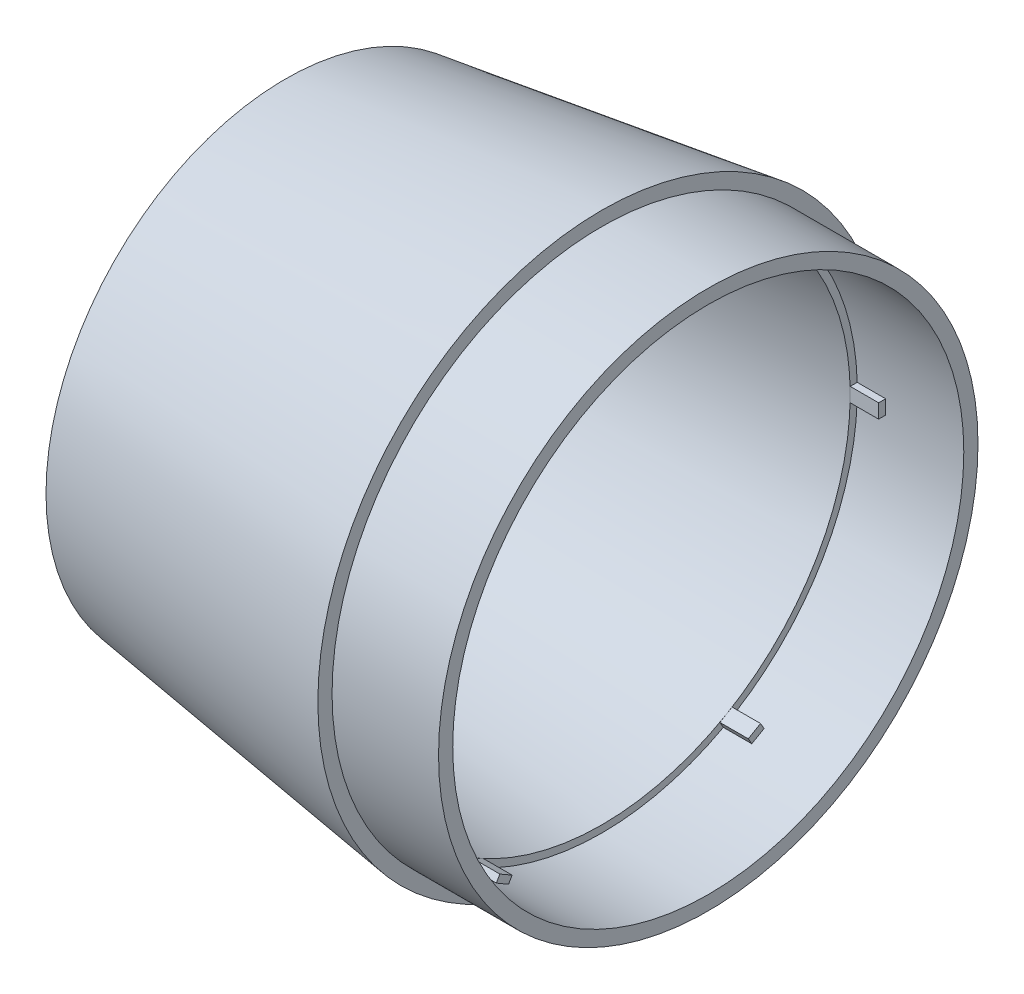
ISO-10303-21;
HEADER;
FILE_DESCRIPTION(('STEP AP214'),'2;1');
FILE_NAME('part.step','',(''),(''),'','','');
FILE_SCHEMA(('AUTOMOTIVE_DESIGN { 1 0 10303 214 1 1 1 1 }'));
ENDSEC;
DATA;
#1=APPLICATION_CONTEXT('core data for automotive mechanical design processes');
#2=APPLICATION_PROTOCOL_DEFINITION('international standard','automotive_design',2000,#1);
#3=PRODUCT_CONTEXT('',#1,'mechanical');
#4=PRODUCT('Part','Part','',(#3));
#5=PRODUCT_RELATED_PRODUCT_CATEGORY('part','',(#4));
#6=PRODUCT_DEFINITION_FORMATION('','',#4);
#7=PRODUCT_DEFINITION_CONTEXT('part definition',#1,'design');
#8=PRODUCT_DEFINITION('design','',#6,#7);
#9=PRODUCT_DEFINITION_SHAPE('','',#8);
#10=(LENGTH_UNIT() NAMED_UNIT(*) SI_UNIT(.MILLI.,.METRE.));
#11=(NAMED_UNIT(*) PLANE_ANGLE_UNIT() SI_UNIT($,.RADIAN.));
#12=(NAMED_UNIT(*) SI_UNIT($,.STERADIAN.) SOLID_ANGLE_UNIT());
#13=UNCERTAINTY_MEASURE_WITH_UNIT(LENGTH_MEASURE(1.E-05),#10,'distance_accuracy_value','');
#14=(GEOMETRIC_REPRESENTATION_CONTEXT(3) GLOBAL_UNCERTAINTY_ASSIGNED_CONTEXT((#13)) GLOBAL_UNIT_ASSIGNED_CONTEXT((#10,
#11,#12)) REPRESENTATION_CONTEXT('',''));
#15=CARTESIAN_POINT('',(0.,0.,0.));
#16=DIRECTION('',(0.,0.,1.));
#17=DIRECTION('',(1.,0.,0.));
#18=AXIS2_PLACEMENT_3D('',#15,#16,#17);
#19=CARTESIAN_POINT('',(0.,0.,0.));
#20=DIRECTION('',(1.,0.,0.));
#21=DIRECTION('',(0.,0.,-1.));
#22=AXIS2_PLACEMENT_3D('',#19,#20,#21);
#23=PLANE('',#22);
#24=DIRECTION('',(0.,0.50000000000001,0.866025403784433));
#25=VECTOR('',#24,1.);
#26=CARTESIAN_POINT('',(0.,-30.8108891324552,16.6339745962159));
#27=LINE('',#26,#25);
#28=CARTESIAN_POINT('',(0.,-30.8108891324552,16.6339745962159));
#29=VERTEX_POINT('',#28);
#30=CARTESIAN_POINT('',(0.,-30.3108891324552,17.5000000000003));
#31=VERTEX_POINT('',#30);
#32=EDGE_CURVE('E317',#29,#31,#27,.T.);
#33=ORIENTED_EDGE('',*,*,#32,.F.);
#34=DIRECTION('',(0.,-0.866025403784433,0.50000000000001));
#35=VECTOR('',#34,1.);
#36=CARTESIAN_POINT('',(0.,-30.8108891324552,16.6339745962159));
#37=LINE('',#36,#35);
#38=CARTESIAN_POINT('',(0.,-31.6648840844946,17.1270288116625));
#39=VERTEX_POINT('',#38);
#40=EDGE_CURVE('E309',#29,#39,#37,.T.);
#41=ORIENTED_EDGE('',*,*,#40,.T.);
#42=CARTESIAN_POINT('',(0.,0.,0.));
#43=DIRECTION('',(-1.,0.,0.));
#44=DIRECTION('',(0.,0.,1.));
#45=AXIS2_PLACEMENT_3D('',#42,#43,#44);
#46=CIRCLE('',#45,36.);
#47=CARTESIAN_POINT('',(0.,-31.664884084495,-17.1270288116618));
#48=VERTEX_POINT('',#47);
#49=EDGE_CURVE('E544',#48,#39,#46,.T.);
#50=ORIENTED_EDGE('',*,*,#49,.F.);
#51=DIRECTION('',(0.,-0.866025403784443,-0.499999999999992));
#52=VECTOR('',#51,1.);
#53=CARTESIAN_POINT('',(0.,-30.8108891324555,-16.6339745962153));
#54=LINE('',#53,#52);
#55=CARTESIAN_POINT('',(0.,-30.8108891324555,-16.6339745962153));
#56=VERTEX_POINT('',#55);
#57=EDGE_CURVE('E64',#56,#48,#54,.T.);
#58=ORIENTED_EDGE('',*,*,#57,.F.);
#59=DIRECTION('',(0.,-0.499999999999992,0.866025403784443));
#60=VECTOR('',#59,1.);
#61=CARTESIAN_POINT('',(0.,-29.8108891324555,-18.3660254037842));
#62=LINE('',#61,#60);
#63=CARTESIAN_POINT('',(0.,-30.3108891324555,-17.4999999999997));
#64=VERTEX_POINT('',#63);
#65=EDGE_CURVE('E296',#64,#56,#62,.T.);
#66=ORIENTED_EDGE('',*,*,#65,.F.);
#67=CARTESIAN_POINT('',(0.,0.,0.));
#68=DIRECTION('',(-1.,0.,0.));
#69=DIRECTION('',(0.,0.,1.));
#70=AXIS2_PLACEMENT_3D('',#67,#68,#69);
#71=CIRCLE('',#70,35.);
#72=EDGE_CURVE('E456',#64,#31,#71,.T.);
#73=ORIENTED_EDGE('',*,*,#72,.T.);
#74=EDGE_LOOP('',(#33,#41,#50,#58,#66,#73));
#75=FACE_BOUND('',#74,.T.);
#76=ADVANCED_FACE('F41',(#75),#23,.T.);
#77=CARTESIAN_POINT('',(0.,-29.8108891324555,-18.3660254037842));
#78=VERTEX_POINT('',#77);
#79=EDGE_CURVE('E299',#78,#64,#62,.T.);
#80=ORIENTED_EDGE('',*,*,#79,.F.);
#81=DIRECTION('',(0.,-0.866025403784443,-0.499999999999992));
#82=VECTOR('',#81,1.);
#83=CARTESIAN_POINT('',(0.,-29.8108891324555,-18.3660254037842));
#84=LINE('',#83,#82);
#85=CARTESIAN_POINT('',(0.,-30.664884084495,-18.8590796192307));
#86=VERTEX_POINT('',#85);
#87=EDGE_CURVE('E291',#78,#86,#84,.T.);
#88=ORIENTED_EDGE('',*,*,#87,.T.);
#89=CARTESIAN_POINT('',(0.,-1.,-35.9861084308932));
#90=VERTEX_POINT('',#89);
#91=EDGE_CURVE('E495',#90,#86,#46,.T.);
#92=ORIENTED_EDGE('',*,*,#91,.F.);
#93=DIRECTION('',(0.,0.,-1.));
#94=VECTOR('',#93,1.);
#95=CARTESIAN_POINT('',(0.,-1.,-35.));
#96=LINE('',#95,#94);
#97=CARTESIAN_POINT('',(0.,-1.,-35.));
#98=VERTEX_POINT('',#97);
#99=EDGE_CURVE('E265',#98,#90,#96,.T.);
#100=ORIENTED_EDGE('',*,*,#99,.F.);
#101=DIRECTION('',(0.,-1.,0.));
#102=VECTOR('',#101,1.);
#103=CARTESIAN_POINT('',(0.,1.,-35.));
#104=LINE('',#103,#102);
#105=CARTESIAN_POINT('',(0.,0.,-35.));
#106=VERTEX_POINT('',#105);
#107=EDGE_CURVE('E277',#106,#98,#104,.T.);
#108=ORIENTED_EDGE('',*,*,#107,.F.);
#109=EDGE_CURVE('E461',#106,#64,#71,.T.);
#110=ORIENTED_EDGE('',*,*,#109,.T.);
#111=EDGE_LOOP('',(#80,#88,#92,#100,#108,#110));
#112=FACE_BOUND('',#111,.T.);
#113=ADVANCED_FACE('F492',(#112),#23,.T.);
#114=CARTESIAN_POINT('',(0.,1.,-35.));
#115=VERTEX_POINT('',#114);
#116=EDGE_CURVE('E280',#115,#106,#104,.T.);
#117=ORIENTED_EDGE('',*,*,#116,.F.);
#118=DIRECTION('',(0.,0.,-1.));
#119=VECTOR('',#118,1.);
#120=CARTESIAN_POINT('',(0.,1.,-35.));
#121=LINE('',#120,#119);
#122=CARTESIAN_POINT('',(0.,1.,-35.9861084308932));
#123=VERTEX_POINT('',#122);
#124=EDGE_CURVE('E273',#115,#123,#121,.T.);
#125=ORIENTED_EDGE('',*,*,#124,.T.);
#126=CARTESIAN_POINT('',(0.,30.6648840844948,-18.8590796192312));
#127=VERTEX_POINT('',#126);
#128=EDGE_CURVE('E249',#127,#123,#46,.T.);
#129=ORIENTED_EDGE('',*,*,#128,.F.);
#130=DIRECTION('',(0.,0.866025403784436,-0.500000000000004));
#131=VECTOR('',#130,1.);
#132=CARTESIAN_POINT('',(0.,29.8108891324553,-18.3660254037846));
#133=LINE('',#132,#131);
#134=CARTESIAN_POINT('',(0.,29.8108891324553,-18.3660254037846));
#135=VERTEX_POINT('',#134);
#136=EDGE_CURVE('E237',#135,#127,#133,.T.);
#137=ORIENTED_EDGE('',*,*,#136,.F.);
#138=DIRECTION('',(0.,-0.500000000000004,-0.866025403784436));
#139=VECTOR('',#138,1.);
#140=CARTESIAN_POINT('',(0.,30.8108891324553,-16.6339745962157));
#141=LINE('',#140,#139);
#142=CARTESIAN_POINT('',(0.,30.3108891324553,-17.5000000000001));
#143=VERTEX_POINT('',#142);
#144=EDGE_CURVE('E221',#143,#135,#141,.T.);
#145=ORIENTED_EDGE('',*,*,#144,.F.);
#146=EDGE_CURVE('E462',#143,#106,#71,.T.);
#147=ORIENTED_EDGE('',*,*,#146,.T.);
#148=EDGE_LOOP('',(#117,#125,#129,#137,#145,#147));
#149=FACE_BOUND('',#148,.T.);
#150=ADVANCED_FACE('F246',(#149),#23,.T.);
#151=CARTESIAN_POINT('',(0.,30.8108891324553,-16.6339745962157));
#152=VERTEX_POINT('',#151);
#153=EDGE_CURVE('E228',#152,#143,#141,.T.);
#154=ORIENTED_EDGE('',*,*,#153,.F.);
#155=DIRECTION('',(0.,0.866025403784436,-0.500000000000004));
#156=VECTOR('',#155,1.);
#157=CARTESIAN_POINT('',(0.,30.8108891324553,-16.6339745962157));
#158=LINE('',#157,#156);
#159=CARTESIAN_POINT('',(0.,31.6648840844948,-17.1270288116623));
#160=VERTEX_POINT('',#159);
#161=EDGE_CURVE('E255',#152,#160,#158,.T.);
#162=ORIENTED_EDGE('',*,*,#161,.T.);
#163=CARTESIAN_POINT('',(0.,31.6648840844949,17.1270288116621));
#164=VERTEX_POINT('',#163);
#165=EDGE_CURVE('E392',#164,#160,#46,.T.);
#166=ORIENTED_EDGE('',*,*,#165,.F.);
#167=DIRECTION('',(0.,0.86602540378444,0.499999999999998));
#168=VECTOR('',#167,1.);
#169=CARTESIAN_POINT('',(0.,30.8108891324554,16.6339745962155));
#170=LINE('',#169,#168);
#171=CARTESIAN_POINT('',(0.,30.8108891324554,16.6339745962155));
#172=VERTEX_POINT('',#171);
#173=EDGE_CURVE('E321',#172,#164,#170,.T.);
#174=ORIENTED_EDGE('',*,*,#173,.F.);
#175=DIRECTION('',(0.,0.499999999999998,-0.86602540378444));
#176=VECTOR('',#175,1.);
#177=CARTESIAN_POINT('',(0.,29.8108891324554,18.3660254037844));
#178=LINE('',#177,#176);
#179=CARTESIAN_POINT('',(0.,30.3108891324554,17.4999999999999));
#180=VERTEX_POINT('',#179);
#181=EDGE_CURVE('E333',#180,#172,#178,.T.);
#182=ORIENTED_EDGE('',*,*,#181,.F.);
#183=EDGE_CURVE('E366',#180,#143,#71,.T.);
#184=ORIENTED_EDGE('',*,*,#183,.T.);
#185=EDGE_LOOP('',(#154,#162,#166,#174,#182,#184));
#186=FACE_BOUND('',#185,.T.);
#187=ADVANCED_FACE('F531',(#186),#23,.T.);
#188=CARTESIAN_POINT('',(0.,29.8108891324554,18.3660254037844));
#189=VERTEX_POINT('',#188);
#190=EDGE_CURVE('E338',#189,#180,#178,.T.);
#191=ORIENTED_EDGE('',*,*,#190,.F.);
#192=DIRECTION('',(0.,0.86602540378444,0.499999999999998));
#193=VECTOR('',#192,1.);
#194=CARTESIAN_POINT('',(0.,29.8108891324554,18.3660254037844));
#195=LINE('',#194,#193);
#196=CARTESIAN_POINT('',(0.,30.6648840844949,18.8590796192309));
#197=VERTEX_POINT('',#196);
#198=EDGE_CURVE('E328',#189,#197,#195,.T.);
#199=ORIENTED_EDGE('',*,*,#198,.T.);
#200=CARTESIAN_POINT('',(0.,1.,35.9861084308932));
#201=VERTEX_POINT('',#200);
#202=EDGE_CURVE('E388',#201,#197,#46,.T.);
#203=ORIENTED_EDGE('',*,*,#202,.F.);
#204=DIRECTION('',(0.,0.,1.));
#205=VECTOR('',#204,1.);
#206=CARTESIAN_POINT('',(0.,1.,35.));
#207=LINE('',#206,#205);
#208=CARTESIAN_POINT('',(0.,1.,35.));
#209=VERTEX_POINT('',#208);
#210=EDGE_CURVE('E342',#209,#201,#207,.T.);
#211=ORIENTED_EDGE('',*,*,#210,.F.);
#212=DIRECTION('',(0.,1.,0.));
#213=VECTOR('',#212,1.);
#214=CARTESIAN_POINT('',(0.,-1.,35.));
#215=LINE('',#214,#213);
#216=CARTESIAN_POINT('',(0.,0.,35.));
#217=VERTEX_POINT('',#216);
#218=EDGE_CURVE('E354',#217,#209,#215,.T.);
#219=ORIENTED_EDGE('',*,*,#218,.F.);
#220=EDGE_CURVE('E362',#217,#180,#71,.T.);
#221=ORIENTED_EDGE('',*,*,#220,.T.);
#222=EDGE_LOOP('',(#191,#199,#203,#211,#219,#221));
#223=FACE_BOUND('',#222,.T.);
#224=ADVANCED_FACE('F475',(#223),#23,.T.);
#225=CARTESIAN_POINT('',(-44.3163488855493,0.,0.));
#226=DIRECTION('',(-1.,0.,0.));
#227=DIRECTION('',(0.,0.,1.));
#228=AXIS2_PLACEMENT_3D('',#225,#226,#227);
#229=CYLINDRICAL_SURFACE('',#228,36.);
#230=CARTESIAN_POINT('',(15.,0.,0.));
#231=DIRECTION('',(-1.,0.,0.));
#232=DIRECTION('',(0.,0.,1.));
#233=AXIS2_PLACEMENT_3D('',#230,#231,#232);
#234=CIRCLE('',#233,36.);
#235=CARTESIAN_POINT('',(15.,0.,36.));
#236=VERTEX_POINT('',#235);
#237=EDGE_CURVE('E384',#236,#236,#234,.T.);
#238=ORIENTED_EDGE('',*,*,#237,.F.);
#239=EDGE_LOOP('',(#238));
#240=FACE_BOUND('',#239,.T.);
#241=DIRECTION('',(-1.,0.,0.));
#242=VECTOR('',#241,1.);
#243=CARTESIAN_POINT('',(-44.3163488855493,-31.6648840844946,17.1270288116625));
#244=LINE('',#243,#242);
#245=CARTESIAN_POINT('',(4.,-31.6648840844946,17.1270288116625));
#246=VERTEX_POINT('',#245);
#247=EDGE_CURVE('E11',#246,#39,#244,.T.);
#248=ORIENTED_EDGE('',*,*,#247,.F.);
#249=CARTESIAN_POINT('',(3.99999999999997,0.,0.));
#250=DIRECTION('',(1.,0.,0.));
#251=DIRECTION('',(0.,1.,0.));
#252=AXIS2_PLACEMENT_3D('',#249,#250,#251);
#253=CIRCLE('',#252,36.);
#254=CARTESIAN_POINT('',(4.,-30.6648840844946,18.8590796192314));
#255=VERTEX_POINT('',#254);
#256=EDGE_CURVE('E49',#246,#255,#253,.F.);
#257=ORIENTED_EDGE('',*,*,#256,.T.);
#258=DIRECTION('',(-1.,0.,0.));
#259=VECTOR('',#258,1.);
#260=CARTESIAN_POINT('',(-44.3163488855493,-30.6648840844946,18.8590796192314));
#261=LINE('',#260,#259);
#262=CARTESIAN_POINT('',(0.,-30.6648840844946,18.8590796192314));
#263=VERTEX_POINT('',#262);
#264=EDGE_CURVE('E431',#255,#263,#261,.T.);
#265=ORIENTED_EDGE('',*,*,#264,.T.);
#266=CARTESIAN_POINT('',(0.,-1.,35.9861084308932));
#267=VERTEX_POINT('',#266);
#268=EDGE_CURVE('E387',#263,#267,#46,.T.);
#269=ORIENTED_EDGE('',*,*,#268,.T.);
#270=DIRECTION('',(-1.,0.,0.));
#271=VECTOR('',#270,1.);
#272=CARTESIAN_POINT('',(-44.3163488855493,-1.,35.9861084308932));
#273=LINE('',#272,#271);
#274=CARTESIAN_POINT('',(4.,-1.,35.9861084308932));
#275=VERTEX_POINT('',#274);
#276=EDGE_CURVE('E398',#275,#267,#273,.T.);
#277=ORIENTED_EDGE('',*,*,#276,.F.);
#278=CARTESIAN_POINT('',(3.99999999999996,0.,0.));
#279=DIRECTION('',(1.,0.,0.));
#280=DIRECTION('',(0.,0.,-1.));
#281=AXIS2_PLACEMENT_3D('',#278,#279,#280);
#282=CIRCLE('',#281,36.);
#283=CARTESIAN_POINT('',(4.,1.,35.9861084308932));
#284=VERTEX_POINT('',#283);
#285=EDGE_CURVE('E395',#275,#284,#282,.F.);
#286=ORIENTED_EDGE('',*,*,#285,.T.);
#287=DIRECTION('',(-1.,0.,0.));
#288=VECTOR('',#287,1.);
#289=CARTESIAN_POINT('',(-44.3163488855493,1.,35.9861084308932));
#290=LINE('',#289,#288);
#291=EDGE_CURVE('E391',#284,#201,#290,.T.);
#292=ORIENTED_EDGE('',*,*,#291,.T.);
#293=ORIENTED_EDGE('',*,*,#202,.T.);
#294=DIRECTION('',(-1.,0.,0.));
#295=VECTOR('',#294,1.);
#296=CARTESIAN_POINT('',(-44.3163488855493,30.6648840844949,18.8590796192309));
#297=LINE('',#296,#295);
#298=CARTESIAN_POINT('',(4.,30.6648840844949,18.8590796192309));
#299=VERTEX_POINT('',#298);
#300=EDGE_CURVE('E407',#299,#197,#297,.T.);
#301=ORIENTED_EDGE('',*,*,#300,.F.);
#302=CARTESIAN_POINT('',(3.99999999999997,0.,0.));
#303=DIRECTION('',(1.,0.,0.));
#304=DIRECTION('',(0.,1.,0.));
#305=AXIS2_PLACEMENT_3D('',#302,#303,#304);
#306=CIRCLE('',#305,36.);
#307=CARTESIAN_POINT('',(4.,31.6648840844949,17.1270288116621));
#308=VERTEX_POINT('',#307);
#309=EDGE_CURVE('E404',#299,#308,#306,.F.);
#310=ORIENTED_EDGE('',*,*,#309,.T.);
#311=DIRECTION('',(-1.,0.,0.));
#312=VECTOR('',#311,1.);
#313=CARTESIAN_POINT('',(-44.3163488855493,31.6648840844949,17.1270288116621));
#314=LINE('',#313,#312);
#315=EDGE_CURVE('E401',#308,#164,#314,.T.);
#316=ORIENTED_EDGE('',*,*,#315,.T.);
#317=ORIENTED_EDGE('',*,*,#165,.T.);
#318=DIRECTION('',(-1.,0.,0.));
#319=VECTOR('',#318,1.);
#320=CARTESIAN_POINT('',(-44.3163488855493,31.6648840844948,-17.1270288116623));
#321=LINE('',#320,#319);
#322=CARTESIAN_POINT('',(4.,31.6648840844948,-17.1270288116623));
#323=VERTEX_POINT('',#322);
#324=EDGE_CURVE('E414',#323,#160,#321,.T.);
#325=ORIENTED_EDGE('',*,*,#324,.F.);
#326=CARTESIAN_POINT('',(3.99999999999997,0.,0.));
#327=DIRECTION('',(1.,0.,0.));
#328=DIRECTION('',(0.,1.,0.));
#329=AXIS2_PLACEMENT_3D('',#326,#327,#328);
#330=CIRCLE('',#329,36.);
#331=CARTESIAN_POINT('',(4.,30.6648840844948,-18.8590796192312));
#332=VERTEX_POINT('',#331);
#333=EDGE_CURVE('E411',#323,#332,#330,.F.);
#334=ORIENTED_EDGE('',*,*,#333,.T.);
#335=DIRECTION('',(-1.,0.,0.));
#336=VECTOR('',#335,1.);
#337=CARTESIAN_POINT('',(-44.3163488855493,30.6648840844948,-18.8590796192312));
#338=LINE('',#337,#336);
#339=EDGE_CURVE('E409',#332,#127,#338,.T.);
#340=ORIENTED_EDGE('',*,*,#339,.T.);
#341=ORIENTED_EDGE('',*,*,#128,.T.);
#342=DIRECTION('',(-1.,0.,0.));
#343=VECTOR('',#342,1.);
#344=CARTESIAN_POINT('',(-44.3163488855493,1.,-35.9861084308932));
#345=LINE('',#344,#343);
#346=CARTESIAN_POINT('',(4.,1.,-35.9861084308932));
#347=VERTEX_POINT('',#346);
#348=EDGE_CURVE('E422',#347,#123,#345,.T.);
#349=ORIENTED_EDGE('',*,*,#348,.F.);
#350=CARTESIAN_POINT('',(3.99999999999996,0.,0.));
#351=DIRECTION('',(1.,0.,0.));
#352=DIRECTION('',(0.,0.,-1.));
#353=AXIS2_PLACEMENT_3D('',#350,#351,#352);
#354=CIRCLE('',#353,36.);
#355=CARTESIAN_POINT('',(4.,-1.,-35.9861084308932));
#356=VERTEX_POINT('',#355);
#357=EDGE_CURVE('E419',#347,#356,#354,.F.);
#358=ORIENTED_EDGE('',*,*,#357,.T.);
#359=DIRECTION('',(-1.,0.,0.));
#360=VECTOR('',#359,1.);
#361=CARTESIAN_POINT('',(-44.3163488855493,-1.,-35.9861084308932));
#362=LINE('',#361,#360);
#363=EDGE_CURVE('E416',#356,#90,#362,.T.);
#364=ORIENTED_EDGE('',*,*,#363,.T.);
#365=ORIENTED_EDGE('',*,*,#91,.T.);
#366=DIRECTION('',(-1.,0.,0.));
#367=VECTOR('',#366,1.);
#368=CARTESIAN_POINT('',(-44.3163488855493,-30.664884084495,-18.8590796192307));
#369=LINE('',#368,#367);
#370=CARTESIAN_POINT('',(4.,-30.664884084495,-18.8590796192307));
#371=VERTEX_POINT('',#370);
#372=EDGE_CURVE('E429',#371,#86,#369,.T.);
#373=ORIENTED_EDGE('',*,*,#372,.F.);
#374=CARTESIAN_POINT('',(3.99999999999997,0.,0.));
#375=DIRECTION('',(1.,0.,0.));
#376=DIRECTION('',(0.,1.,0.));
#377=AXIS2_PLACEMENT_3D('',#374,#375,#376);
#378=CIRCLE('',#377,36.);
#379=CARTESIAN_POINT('',(4.,-31.664884084495,-17.1270288116618));
#380=VERTEX_POINT('',#379);
#381=EDGE_CURVE('E426',#371,#380,#378,.F.);
#382=ORIENTED_EDGE('',*,*,#381,.T.);
#383=DIRECTION('',(-1.,0.,0.));
#384=VECTOR('',#383,1.);
#385=CARTESIAN_POINT('',(-44.3163488855493,-31.664884084495,-17.1270288116619));
#386=LINE('',#385,#384);
#387=EDGE_CURVE('E424',#380,#48,#386,.T.);
#388=ORIENTED_EDGE('',*,*,#387,.T.);
#389=ORIENTED_EDGE('',*,*,#49,.T.);
#390=EDGE_LOOP('',(#248,#257,#265,#269,#277,#286,#292,#293,#301,#310,#316,#317,#325,#334,#340,
#341,#349,#358,#364,#365,#373,#382,#388,#389));
#391=FACE_BOUND('',#390,.T.);
#392=ADVANCED_FACE('F435',(#240,#391),#229,.F.);
#393=CARTESIAN_POINT('',(0.,-29.8108891324551,18.3660254037848));
#394=VERTEX_POINT('',#393);
#395=EDGE_CURVE('E314',#31,#394,#27,.T.);
#396=ORIENTED_EDGE('',*,*,#395,.F.);
#397=EDGE_CURVE('E358',#31,#217,#71,.T.);
#398=ORIENTED_EDGE('',*,*,#397,.T.);
#399=CARTESIAN_POINT('',(0.,-1.,35.));
#400=VERTEX_POINT('',#399);
#401=EDGE_CURVE('E359',#400,#217,#215,.T.);
#402=ORIENTED_EDGE('',*,*,#401,.F.);
#403=DIRECTION('',(0.,0.,1.));
#404=VECTOR('',#403,1.);
#405=CARTESIAN_POINT('',(0.,-1.,35.));
#406=LINE('',#405,#404);
#407=EDGE_CURVE('E349',#400,#267,#406,.T.);
#408=ORIENTED_EDGE('',*,*,#407,.T.);
#409=ORIENTED_EDGE('',*,*,#268,.F.);
#410=DIRECTION('',(0.,-0.866025403784433,0.50000000000001));
#411=VECTOR('',#410,1.);
#412=CARTESIAN_POINT('',(0.,-29.8108891324551,18.3660254037848));
#413=LINE('',#412,#411);
#414=EDGE_CURVE('E56',#394,#263,#413,.T.);
#415=ORIENTED_EDGE('',*,*,#414,.F.);
#416=EDGE_LOOP('',(#396,#398,#402,#408,#409,#415));
#417=FACE_BOUND('',#416,.T.);
#418=ADVANCED_FACE('F43',(#417),#23,.T.);
#419=CARTESIAN_POINT('',(15.,0.,0.));
#420=DIRECTION('',(-1.,0.,0.));
#421=DIRECTION('',(0.,0.,1.));
#422=AXIS2_PLACEMENT_3D('',#419,#420,#421);
#423=PLANE('',#422);
#424=CARTESIAN_POINT('',(15.,0.,0.));
#425=DIRECTION('',(-1.,0.,0.));
#426=DIRECTION('',(0.,0.,1.));
#427=AXIS2_PLACEMENT_3D('',#424,#425,#426);
#428=CIRCLE('',#427,38.);
#429=CARTESIAN_POINT('',(15.,0.,38.));
#430=VERTEX_POINT('',#429);
#431=EDGE_CURVE('E381',#430,#430,#428,.T.);
#432=ORIENTED_EDGE('',*,*,#431,.F.);
#433=EDGE_LOOP('',(#432));
#434=FACE_BOUND('',#433,.T.);
#435=ORIENTED_EDGE('',*,*,#237,.T.);
#436=EDGE_LOOP('',(#435));
#437=FACE_BOUND('',#436,.T.);
#438=ADVANCED_FACE('F520',(#434,#437),#423,.F.);
#439=CARTESIAN_POINT('',(-44.3163488855493,0.,0.));
#440=DIRECTION('',(-1.,0.,0.));
#441=DIRECTION('',(0.,0.,1.));
#442=AXIS2_PLACEMENT_3D('',#439,#440,#441);
#443=CYLINDRICAL_SURFACE('',#442,38.);
#444=ORIENTED_EDGE('',*,*,#431,.T.);
#445=EDGE_LOOP('',(#444));
#446=FACE_BOUND('',#445,.T.);
#447=CARTESIAN_POINT('',(0.,0.,0.));
#448=DIRECTION('',(-1.,0.,0.));
#449=DIRECTION('',(0.,0.,1.));
#450=AXIS2_PLACEMENT_3D('',#447,#448,#449);
#451=CIRCLE('',#450,38.);
#452=CARTESIAN_POINT('',(0.,0.,38.));
#453=VERTEX_POINT('',#452);
#454=EDGE_CURVE('E378',#453,#453,#451,.T.);
#455=ORIENTED_EDGE('',*,*,#454,.F.);
#456=EDGE_LOOP('',(#455));
#457=FACE_BOUND('',#456,.T.);
#458=ADVANCED_FACE('F526',(#446,#457),#443,.T.);
#459=CARTESIAN_POINT('',(0.,0.,0.));
#460=DIRECTION('',(1.,0.,0.));
#461=DIRECTION('',(0.,0.,-1.));
#462=AXIS2_PLACEMENT_3D('',#459,#460,#461);
#463=PLANE('',#462);
#464=ORIENTED_EDGE('',*,*,#454,.T.);
#465=EDGE_LOOP('',(#464));
#466=FACE_BOUND('',#465,.T.);
#467=CARTESIAN_POINT('',(0.,0.,0.));
#468=DIRECTION('',(-1.,0.,0.));
#469=DIRECTION('',(0.,0.,1.));
#470=AXIS2_PLACEMENT_3D('',#467,#468,#469);
#471=CIRCLE('',#470,40.);
#472=CARTESIAN_POINT('',(0.,0.,40.));
#473=VERTEX_POINT('',#472);
#474=EDGE_CURVE('E375',#473,#473,#471,.T.);
#475=ORIENTED_EDGE('',*,*,#474,.F.);
#476=EDGE_LOOP('',(#475));
#477=FACE_BOUND('',#476,.T.);
#478=ADVANCED_FACE('F601',(#466,#477),#463,.T.);
#479=CARTESIAN_POINT('',(0.,0.,0.));
#480=DIRECTION('',(1.,0.,0.));
#481=DIRECTION('',(0.,0.,-1.));
#482=AXIS2_PLACEMENT_3D('',#479,#480,#481);
#483=CONICAL_SURFACE('',#482,40.,0.139626340159553);
#484=CARTESIAN_POINT('',(-44.5620630933707,0.,0.));
#485=DIRECTION('',(-1.,0.,0.));
#486=DIRECTION('',(0.,0.,1.));
#487=AXIS2_PLACEMENT_3D('',#484,#485,#486);
#488=CIRCLE('',#487,33.7372104567968);
#489=CARTESIAN_POINT('',(-44.5620630933707,0.,33.7372104567968));
#490=VERTEX_POINT('',#489);
#491=EDGE_CURVE('E372',#490,#490,#488,.T.);
#492=ORIENTED_EDGE('',*,*,#491,.F.);
#493=EDGE_LOOP('',(#492));
#494=FACE_BOUND('',#493,.T.);
#495=ORIENTED_EDGE('',*,*,#474,.T.);
#496=EDGE_LOOP('',(#495));
#497=FACE_BOUND('',#496,.T.);
#498=ADVANCED_FACE('F597',(#494,#497),#483,.T.);
#499=CARTESIAN_POINT('',(-44.5620630933707,0.,0.));
#500=DIRECTION('',(1.,0.,0.));
#501=DIRECTION('',(0.,0.,-1.));
#502=AXIS2_PLACEMENT_3D('',#499,#500,#501);
#503=PLANE('',#502);
#504=CARTESIAN_POINT('',(-44.5620630933707,0.,0.));
#505=DIRECTION('',(-1.,0.,0.));
#506=DIRECTION('',(0.,0.,1.));
#507=AXIS2_PLACEMENT_3D('',#504,#505,#506);
#508=CIRCLE('',#507,31.7372104567967);
#509=CARTESIAN_POINT('',(-44.5620630933707,0.,31.7372104567967));
#510=VERTEX_POINT('',#509);
#511=EDGE_CURVE('E369',#510,#510,#508,.T.);
#512=ORIENTED_EDGE('',*,*,#511,.F.);
#513=EDGE_LOOP('',(#512));
#514=FACE_BOUND('',#513,.T.);
#515=ORIENTED_EDGE('',*,*,#491,.T.);
#516=EDGE_LOOP('',(#515));
#517=FACE_BOUND('',#516,.T.);
#518=ADVANCED_FACE('F593',(#514,#517),#503,.F.);
#519=CARTESIAN_POINT('',(-44.3163488855493,0.,0.));
#520=DIRECTION('',(-1.,0.,0.));
#521=DIRECTION('',(0.,0.,1.));
#522=AXIS2_PLACEMENT_3D('',#519,#520,#521);
#523=CYLINDRICAL_SURFACE('',#522,31.7372104567967);
#524=ORIENTED_EDGE('',*,*,#511,.T.);
#525=EDGE_LOOP('',(#524));
#526=FACE_BOUND('',#525,.T.);
#527=CARTESIAN_POINT('',(-33.555064495604,0.,0.));
#528=DIRECTION('',(-1.,0.,0.));
#529=DIRECTION('',(0.,0.,1.));
#530=AXIS2_PLACEMENT_3D('',#527,#528,#529);
#531=CIRCLE('',#530,31.7372104567967);
#532=CARTESIAN_POINT('',(-33.555064495604,0.,31.7372104567967));
#533=VERTEX_POINT('',#532);
#534=EDGE_CURVE('E365',#533,#533,#531,.T.);
#535=ORIENTED_EDGE('',*,*,#534,.F.);
#536=EDGE_LOOP('',(#535));
#537=FACE_BOUND('',#536,.T.);
#538=ADVANCED_FACE('F590',(#526,#537),#523,.F.);
#539=CARTESIAN_POINT('',(-33.555064495604,0.,0.));
#540=DIRECTION('',(1.,0.,0.));
#541=DIRECTION('',(0.,0.,-1.));
#542=AXIS2_PLACEMENT_3D('',#539,#540,#541);
#543=CONICAL_SURFACE('',#542,31.7372104567967,0.0969321413177667);
#544=ORIENTED_EDGE('',*,*,#220,.F.);
#545=ORIENTED_EDGE('',*,*,#397,.F.);
#546=ORIENTED_EDGE('',*,*,#72,.F.);
#547=ORIENTED_EDGE('',*,*,#109,.F.);
#548=ORIENTED_EDGE('',*,*,#146,.F.);
#549=ORIENTED_EDGE('',*,*,#183,.F.);
#550=EDGE_LOOP('',(#544,#545,#546,#547,#548,#549));
#551=FACE_BOUND('',#550,.T.);
#552=ORIENTED_EDGE('',*,*,#534,.T.);
#553=EDGE_LOOP('',(#552));
#554=FACE_BOUND('',#553,.T.);
#555=ADVANCED_FACE('F478',(#551,#554),#543,.F.);
#556=CARTESIAN_POINT('',(4.,-1.,36.));
#557=DIRECTION('',(1.,0.,0.));
#558=DIRECTION('',(0.,0.,-1.));
#559=AXIS2_PLACEMENT_3D('',#556,#557,#558);
#560=PLANE('',#559);
#561=ORIENTED_EDGE('',*,*,#285,.F.);
#562=DIRECTION('',(0.,0.,-1.));
#563=VECTOR('',#562,1.);
#564=CARTESIAN_POINT('',(4.,-1.,36.));
#565=LINE('',#564,#563);
#566=CARTESIAN_POINT('',(4.,-1.,35.));
#567=VERTEX_POINT('',#566);
#568=EDGE_CURVE('E352',#275,#567,#565,.T.);
#569=ORIENTED_EDGE('',*,*,#568,.T.);
#570=DIRECTION('',(0.,1.,0.));
#571=VECTOR('',#570,1.);
#572=CARTESIAN_POINT('',(4.,-1.,35.));
#573=LINE('',#572,#571);
#574=CARTESIAN_POINT('',(4.,1.,35.));
#575=VERTEX_POINT('',#574);
#576=EDGE_CURVE('E355',#567,#575,#573,.T.);
#577=ORIENTED_EDGE('',*,*,#576,.T.);
#578=DIRECTION('',(0.,0.,-1.));
#579=VECTOR('',#578,1.);
#580=CARTESIAN_POINT('',(4.,1.,36.));
#581=LINE('',#580,#579);
#582=EDGE_CURVE('E344',#284,#575,#581,.T.);
#583=ORIENTED_EDGE('',*,*,#582,.F.);
#584=EDGE_LOOP('',(#561,#569,#577,#583));
#585=FACE_BOUND('',#584,.T.);
#586=ADVANCED_FACE('F550',(#585),#560,.T.);
#587=CARTESIAN_POINT('',(0.,-1.,0.));
#588=DIRECTION('',(0.,1.,0.));
#589=DIRECTION('',(0.,0.,1.));
#590=AXIS2_PLACEMENT_3D('',#587,#588,#589);
#591=PLANE('',#590);
#592=ORIENTED_EDGE('',*,*,#568,.F.);
#593=ORIENTED_EDGE('',*,*,#276,.T.);
#594=ORIENTED_EDGE('',*,*,#407,.F.);
#595=DIRECTION('',(-1.,0.,0.));
#596=VECTOR('',#595,1.);
#597=CARTESIAN_POINT('',(4.,-1.,35.));
#598=LINE('',#597,#596);
#599=EDGE_CURVE('E346',#567,#400,#598,.T.);
#600=ORIENTED_EDGE('',*,*,#599,.F.);
#601=EDGE_LOOP('',(#592,#593,#594,#600));
#602=FACE_BOUND('',#601,.T.);
#603=ADVANCED_FACE('F548',(#602),#591,.F.);
#604=CARTESIAN_POINT('',(0.,1.,0.));
#605=DIRECTION('',(0.,1.,0.));
#606=DIRECTION('',(0.,0.,1.));
#607=AXIS2_PLACEMENT_3D('',#604,#605,#606);
#608=PLANE('',#607);
#609=ORIENTED_EDGE('',*,*,#291,.F.);
#610=ORIENTED_EDGE('',*,*,#582,.T.);
#611=DIRECTION('',(-1.,0.,0.));
#612=VECTOR('',#611,1.);
#613=CARTESIAN_POINT('',(4.,1.,35.));
#614=LINE('',#613,#612);
#615=EDGE_CURVE('E337',#575,#209,#614,.T.);
#616=ORIENTED_EDGE('',*,*,#615,.T.);
#617=ORIENTED_EDGE('',*,*,#210,.T.);
#618=EDGE_LOOP('',(#609,#610,#616,#617));
#619=FACE_BOUND('',#618,.T.);
#620=ADVANCED_FACE('F553',(#619),#608,.T.);
#621=CARTESIAN_POINT('',(4.,-1.,35.));
#622=DIRECTION('',(0.,0.,-1.));
#623=DIRECTION('',(-1.,0.,0.));
#624=AXIS2_PLACEMENT_3D('',#621,#622,#623);
#625=PLANE('',#624);
#626=ORIENTED_EDGE('',*,*,#401,.T.);
#627=ORIENTED_EDGE('',*,*,#218,.T.);
#628=ORIENTED_EDGE('',*,*,#615,.F.);
#629=ORIENTED_EDGE('',*,*,#576,.F.);
#630=ORIENTED_EDGE('',*,*,#599,.T.);
#631=EDGE_LOOP('',(#626,#627,#628,#629,#630));
#632=FACE_BOUND('',#631,.T.);
#633=ADVANCED_FACE('F468',(#632),#625,.T.);
#634=CARTESIAN_POINT('',(4.,30.6769145362398,18.8660254037844));
#635=DIRECTION('',(1.,0.,0.));
#636=DIRECTION('',(0.,1.,0.));
#637=AXIS2_PLACEMENT_3D('',#634,#635,#636);
#638=PLANE('',#637);
#639=ORIENTED_EDGE('',*,*,#309,.F.);
#640=DIRECTION('',(0.,-0.86602540378444,-0.499999999999998));
#641=VECTOR('',#640,1.);
#642=CARTESIAN_POINT('',(4.,30.6769145362398,18.8660254037844));
#643=LINE('',#642,#641);
#644=CARTESIAN_POINT('',(4.,29.8108891324554,18.3660254037844));
#645=VERTEX_POINT('',#644);
#646=EDGE_CURVE('E331',#299,#645,#643,.T.);
#647=ORIENTED_EDGE('',*,*,#646,.T.);
#648=DIRECTION('',(0.,0.499999999999998,-0.86602540378444));
#649=VECTOR('',#648,1.);
#650=CARTESIAN_POINT('',(4.,29.8108891324554,18.3660254037844));
#651=LINE('',#650,#649);
#652=CARTESIAN_POINT('',(4.,30.8108891324554,16.6339745962155));
#653=VERTEX_POINT('',#652);
#654=EDGE_CURVE('E334',#645,#653,#651,.T.);
#655=ORIENTED_EDGE('',*,*,#654,.T.);
#656=DIRECTION('',(0.,-0.86602540378444,-0.499999999999998));
#657=VECTOR('',#656,1.);
#658=CARTESIAN_POINT('',(4.,31.6769145362398,17.1339745962155));
#659=LINE('',#658,#657);
#660=EDGE_CURVE('E323',#308,#653,#659,.T.);
#661=ORIENTED_EDGE('',*,*,#660,.F.);
#662=EDGE_LOOP('',(#639,#647,#655,#661));
#663=FACE_BOUND('',#662,.T.);
#664=ADVANCED_FACE('F565',(#663),#638,.T.);
#665=CARTESIAN_POINT('',(0.,-0.499999999999998,0.86602540378444));
#666=DIRECTION('',(0.,0.499999999999998,-0.86602540378444));
#667=DIRECTION('',(0.,0.86602540378444,0.499999999999998));
#668=AXIS2_PLACEMENT_3D('',#665,#666,#667);
#669=PLANE('',#668);
#670=ORIENTED_EDGE('',*,*,#646,.F.);
#671=ORIENTED_EDGE('',*,*,#300,.T.);
#672=ORIENTED_EDGE('',*,*,#198,.F.);
#673=DIRECTION('',(-1.,0.,0.));
#674=VECTOR('',#673,1.);
#675=CARTESIAN_POINT('',(4.,29.8108891324554,18.3660254037844));
#676=LINE('',#675,#674);
#677=EDGE_CURVE('E325',#645,#189,#676,.T.);
#678=ORIENTED_EDGE('',*,*,#677,.F.);
#679=EDGE_LOOP('',(#670,#671,#672,#678));
#680=FACE_BOUND('',#679,.T.);
#681=ADVANCED_FACE('F558',(#680),#669,.F.);
#682=CARTESIAN_POINT('',(0.,0.499999999999998,-0.86602540378444));
#683=DIRECTION('',(0.,0.499999999999998,-0.86602540378444));
#684=DIRECTION('',(0.,0.86602540378444,0.499999999999998));
#685=AXIS2_PLACEMENT_3D('',#682,#683,#684);
#686=PLANE('',#685);
#687=ORIENTED_EDGE('',*,*,#315,.F.);
#688=ORIENTED_EDGE('',*,*,#660,.T.);
#689=DIRECTION('',(-1.,0.,0.));
#690=VECTOR('',#689,1.);
#691=CARTESIAN_POINT('',(4.,30.8108891324554,16.6339745962155));
#692=LINE('',#691,#690);
#693=EDGE_CURVE('E260',#653,#172,#692,.T.);
#694=ORIENTED_EDGE('',*,*,#693,.T.);
#695=ORIENTED_EDGE('',*,*,#173,.T.);
#696=EDGE_LOOP('',(#687,#688,#694,#695));
#697=FACE_BOUND('',#696,.T.);
#698=ADVANCED_FACE('F567',(#697),#686,.T.);
#699=CARTESIAN_POINT('',(4.,29.8108891324554,18.3660254037844));
#700=DIRECTION('',(0.,-0.86602540378444,-0.499999999999998));
#701=DIRECTION('',(0.,0.499999999999998,-0.86602540378444));
#702=AXIS2_PLACEMENT_3D('',#699,#700,#701);
#703=PLANE('',#702);
#704=ORIENTED_EDGE('',*,*,#190,.T.);
#705=ORIENTED_EDGE('',*,*,#181,.T.);
#706=ORIENTED_EDGE('',*,*,#693,.F.);
#707=ORIENTED_EDGE('',*,*,#654,.F.);
#708=ORIENTED_EDGE('',*,*,#677,.T.);
#709=EDGE_LOOP('',(#704,#705,#706,#707,#708));
#710=FACE_BOUND('',#709,.T.);
#711=ADVANCED_FACE('F561',(#710),#703,.T.);
#712=CARTESIAN_POINT('',(4.,31.6769145362397,-17.1339745962157));
#713=DIRECTION('',(1.,0.,0.));
#714=DIRECTION('',(0.,1.,0.));
#715=AXIS2_PLACEMENT_3D('',#712,#713,#714);
#716=PLANE('',#715);
#717=ORIENTED_EDGE('',*,*,#333,.F.);
#718=DIRECTION('',(0.,-0.866025403784436,0.500000000000004));
#719=VECTOR('',#718,1.);
#720=CARTESIAN_POINT('',(4.,31.6769145362397,-17.1339745962157));
#721=LINE('',#720,#719);
#722=CARTESIAN_POINT('',(4.,30.8108891324553,-16.6339745962157));
#723=VERTEX_POINT('',#722);
#724=EDGE_CURVE('E233',#323,#723,#721,.T.);
#725=ORIENTED_EDGE('',*,*,#724,.T.);
#726=DIRECTION('',(0.,-0.500000000000004,-0.866025403784436));
#727=VECTOR('',#726,1.);
#728=CARTESIAN_POINT('',(4.,30.8108891324553,-16.6339745962157));
#729=LINE('',#728,#727);
#730=CARTESIAN_POINT('',(4.,29.8108891324553,-18.3660254037846));
#731=VERTEX_POINT('',#730);
#732=EDGE_CURVE('E259',#723,#731,#729,.T.);
#733=ORIENTED_EDGE('',*,*,#732,.T.);
#734=DIRECTION('',(0.,-0.866025403784436,0.500000000000004));
#735=VECTOR('',#734,1.);
#736=CARTESIAN_POINT('',(4.,30.6769145362397,-18.8660254037846));
#737=LINE('',#736,#735);
#738=EDGE_CURVE('E240',#332,#731,#737,.T.);
#739=ORIENTED_EDGE('',*,*,#738,.F.);
#740=EDGE_LOOP('',(#717,#725,#733,#739));
#741=FACE_BOUND('',#740,.T.);
#742=ADVANCED_FACE('F574',(#741),#716,.T.);
#743=CARTESIAN_POINT('',(0.,0.500000000000004,0.866025403784436));
#744=DIRECTION('',(0.,-0.500000000000004,-0.866025403784436));
#745=DIRECTION('',(0.,0.866025403784436,-0.500000000000004));
#746=AXIS2_PLACEMENT_3D('',#743,#744,#745);
#747=PLANE('',#746);
#748=ORIENTED_EDGE('',*,*,#724,.F.);
#749=ORIENTED_EDGE('',*,*,#324,.T.);
#750=ORIENTED_EDGE('',*,*,#161,.F.);
#751=DIRECTION('',(-1.,0.,0.));
#752=VECTOR('',#751,1.);
#753=CARTESIAN_POINT('',(4.,30.8108891324553,-16.6339745962157));
#754=LINE('',#753,#752);
#755=EDGE_CURVE('E251',#723,#152,#754,.T.);
#756=ORIENTED_EDGE('',*,*,#755,.F.);
#757=EDGE_LOOP('',(#748,#749,#750,#756));
#758=FACE_BOUND('',#757,.T.);
#759=ADVANCED_FACE('F721',(#758),#747,.F.);
#760=CARTESIAN_POINT('',(0.,-0.500000000000004,-0.866025403784436));
#761=DIRECTION('',(0.,-0.500000000000004,-0.866025403784436));
#762=DIRECTION('',(0.,0.866025403784436,-0.500000000000004));
#763=AXIS2_PLACEMENT_3D('',#760,#761,#762);
#764=PLANE('',#763);
#765=ORIENTED_EDGE('',*,*,#339,.F.);
#766=ORIENTED_EDGE('',*,*,#738,.T.);
#767=DIRECTION('',(-1.,0.,0.));
#768=VECTOR('',#767,1.);
#769=CARTESIAN_POINT('',(4.,29.8108891324553,-18.3660254037846));
#770=LINE('',#769,#768);
#771=EDGE_CURVE('E225',#731,#135,#770,.T.);
#772=ORIENTED_EDGE('',*,*,#771,.T.);
#773=ORIENTED_EDGE('',*,*,#136,.T.);
#774=EDGE_LOOP('',(#765,#766,#772,#773));
#775=FACE_BOUND('',#774,.T.);
#776=ADVANCED_FACE('F236',(#775),#764,.T.);
#777=CARTESIAN_POINT('',(4.,30.8108891324553,-16.6339745962157));
#778=DIRECTION('',(0.,-0.866025403784436,0.500000000000004));
#779=DIRECTION('',(0.,-0.500000000000004,-0.866025403784436));
#780=AXIS2_PLACEMENT_3D('',#777,#778,#779);
#781=PLANE('',#780);
#782=ORIENTED_EDGE('',*,*,#153,.T.);
#783=ORIENTED_EDGE('',*,*,#144,.T.);
#784=ORIENTED_EDGE('',*,*,#771,.F.);
#785=ORIENTED_EDGE('',*,*,#732,.F.);
#786=ORIENTED_EDGE('',*,*,#755,.T.);
#787=EDGE_LOOP('',(#782,#783,#784,#785,#786));
#788=FACE_BOUND('',#787,.T.);
#789=ADVANCED_FACE('F223',(#788),#781,.T.);
#790=CARTESIAN_POINT('',(4.,1.,-36.));
#791=DIRECTION('',(1.,0.,0.));
#792=DIRECTION('',(0.,0.,-1.));
#793=AXIS2_PLACEMENT_3D('',#790,#791,#792);
#794=PLANE('',#793);
#795=ORIENTED_EDGE('',*,*,#357,.F.);
#796=DIRECTION('',(0.,0.,1.));
#797=VECTOR('',#796,1.);
#798=CARTESIAN_POINT('',(4.,1.,-36.));
#799=LINE('',#798,#797);
#800=CARTESIAN_POINT('',(4.,1.,-35.));
#801=VERTEX_POINT('',#800);
#802=EDGE_CURVE('E275',#347,#801,#799,.T.);
#803=ORIENTED_EDGE('',*,*,#802,.T.);
#804=DIRECTION('',(0.,-1.,0.));
#805=VECTOR('',#804,1.);
#806=CARTESIAN_POINT('',(4.,1.,-35.));
#807=LINE('',#806,#805);
#808=CARTESIAN_POINT('',(4.,-1.,-35.));
#809=VERTEX_POINT('',#808);
#810=EDGE_CURVE('E242',#801,#809,#807,.T.);
#811=ORIENTED_EDGE('',*,*,#810,.T.);
#812=DIRECTION('',(0.,0.,1.));
#813=VECTOR('',#812,1.);
#814=CARTESIAN_POINT('',(4.,-1.,-36.));
#815=LINE('',#814,#813);
#816=EDGE_CURVE('E268',#356,#809,#815,.T.);
#817=ORIENTED_EDGE('',*,*,#816,.F.);
#818=EDGE_LOOP('',(#795,#803,#811,#817));
#819=FACE_BOUND('',#818,.T.);
#820=ADVANCED_FACE('F503',(#819),#794,.T.);
#821=CARTESIAN_POINT('',(0.,1.,0.));
#822=DIRECTION('',(0.,-1.,0.));
#823=DIRECTION('',(0.,0.,-1.));
#824=AXIS2_PLACEMENT_3D('',#821,#822,#823);
#825=PLANE('',#824);
#826=ORIENTED_EDGE('',*,*,#802,.F.);
#827=ORIENTED_EDGE('',*,*,#348,.T.);
#828=ORIENTED_EDGE('',*,*,#124,.F.);
#829=DIRECTION('',(-1.,0.,0.));
#830=VECTOR('',#829,1.);
#831=CARTESIAN_POINT('',(4.,1.,-35.));
#832=LINE('',#831,#830);
#833=EDGE_CURVE('E270',#801,#115,#832,.T.);
#834=ORIENTED_EDGE('',*,*,#833,.F.);
#835=EDGE_LOOP('',(#826,#827,#828,#834));
#836=FACE_BOUND('',#835,.T.);
#837=ADVANCED_FACE('F505',(#836),#825,.F.);
#838=CARTESIAN_POINT('',(0.,-1.,0.));
#839=DIRECTION('',(0.,-1.,0.));
#840=DIRECTION('',(0.,0.,-1.));
#841=AXIS2_PLACEMENT_3D('',#838,#839,#840);
#842=PLANE('',#841);
#843=ORIENTED_EDGE('',*,*,#363,.F.);
#844=ORIENTED_EDGE('',*,*,#816,.T.);
#845=DIRECTION('',(-1.,0.,0.));
#846=VECTOR('',#845,1.);
#847=CARTESIAN_POINT('',(4.,-1.,-35.));
#848=LINE('',#847,#846);
#849=EDGE_CURVE('E262',#809,#98,#848,.T.);
#850=ORIENTED_EDGE('',*,*,#849,.T.);
#851=ORIENTED_EDGE('',*,*,#99,.T.);
#852=EDGE_LOOP('',(#843,#844,#850,#851));
#853=FACE_BOUND('',#852,.T.);
#854=ADVANCED_FACE('F497',(#853),#842,.T.);
#855=CARTESIAN_POINT('',(4.,1.,-35.));
#856=DIRECTION('',(0.,0.,1.));
#857=DIRECTION('',(1.,0.,0.));
#858=AXIS2_PLACEMENT_3D('',#855,#856,#857);
#859=PLANE('',#858);
#860=ORIENTED_EDGE('',*,*,#116,.T.);
#861=ORIENTED_EDGE('',*,*,#107,.T.);
#862=ORIENTED_EDGE('',*,*,#849,.F.);
#863=ORIENTED_EDGE('',*,*,#810,.F.);
#864=ORIENTED_EDGE('',*,*,#833,.T.);
#865=EDGE_LOOP('',(#860,#861,#862,#863,#864));
#866=FACE_BOUND('',#865,.T.);
#867=ADVANCED_FACE('F485',(#866),#859,.T.);
#868=CARTESIAN_POINT('',(4.,-30.67691453624,-18.8660254037841));
#869=DIRECTION('',(1.,0.,0.));
#870=DIRECTION('',(0.,1.,0.));
#871=AXIS2_PLACEMENT_3D('',#868,#869,#870);
#872=PLANE('',#871);
#873=ORIENTED_EDGE('',*,*,#381,.F.);
#874=DIRECTION('',(0.,0.866025403784443,0.499999999999992));
#875=VECTOR('',#874,1.);
#876=CARTESIAN_POINT('',(4.,-30.67691453624,-18.8660254037841));
#877=LINE('',#876,#875);
#878=CARTESIAN_POINT('',(4.,-29.8108891324555,-18.3660254037842));
#879=VERTEX_POINT('',#878);
#880=EDGE_CURVE('E294',#371,#879,#877,.T.);
#881=ORIENTED_EDGE('',*,*,#880,.T.);
#882=DIRECTION('',(0.,-0.499999999999992,0.866025403784443));
#883=VECTOR('',#882,1.);
#884=CARTESIAN_POINT('',(4.,-29.8108891324555,-18.3660254037842));
#885=LINE('',#884,#883);
#886=CARTESIAN_POINT('',(4.,-30.8108891324555,-16.6339745962153));
#887=VERTEX_POINT('',#886);
#888=EDGE_CURVE('E266',#879,#887,#885,.T.);
#889=ORIENTED_EDGE('',*,*,#888,.T.);
#890=DIRECTION('',(0.,0.866025403784443,0.499999999999992));
#891=VECTOR('',#890,1.);
#892=CARTESIAN_POINT('',(4.,-31.6769145362399,-17.1339745962153));
#893=LINE('',#892,#891);
#894=EDGE_CURVE('E286',#380,#887,#893,.T.);
#895=ORIENTED_EDGE('',*,*,#894,.F.);
#896=EDGE_LOOP('',(#873,#881,#889,#895));
#897=FACE_BOUND('',#896,.T.);
#898=ADVANCED_FACE('F771',(#897),#872,.T.);
#899=CARTESIAN_POINT('',(0.,0.499999999999992,-0.866025403784443));
#900=DIRECTION('',(0.,-0.499999999999992,0.866025403784443));
#901=DIRECTION('',(0.,-0.866025403784443,-0.499999999999992));
#902=AXIS2_PLACEMENT_3D('',#899,#900,#901);
#903=PLANE('',#902);
#904=ORIENTED_EDGE('',*,*,#880,.F.);
#905=ORIENTED_EDGE('',*,*,#372,.T.);
#906=ORIENTED_EDGE('',*,*,#87,.F.);
#907=DIRECTION('',(-1.,0.,0.));
#908=VECTOR('',#907,1.);
#909=CARTESIAN_POINT('',(4.,-29.8108891324555,-18.3660254037842));
#910=LINE('',#909,#908);
#911=EDGE_CURVE('E288',#879,#78,#910,.T.);
#912=ORIENTED_EDGE('',*,*,#911,.F.);
#913=EDGE_LOOP('',(#904,#905,#906,#912));
#914=FACE_BOUND('',#913,.T.);
#915=ADVANCED_FACE('F780',(#914),#903,.F.);
#916=CARTESIAN_POINT('',(0.,-0.499999999999992,0.866025403784443));
#917=DIRECTION('',(0.,-0.499999999999992,0.866025403784443));
#918=DIRECTION('',(0.,-0.866025403784443,-0.499999999999992));
#919=AXIS2_PLACEMENT_3D('',#916,#917,#918);
#920=PLANE('',#919);
#921=ORIENTED_EDGE('',*,*,#387,.F.);
#922=ORIENTED_EDGE('',*,*,#894,.T.);
#923=DIRECTION('',(-1.,0.,0.));
#924=VECTOR('',#923,1.);
#925=CARTESIAN_POINT('',(4.,-30.8108891324555,-16.6339745962153));
#926=LINE('',#925,#924);
#927=EDGE_CURVE('E282',#887,#56,#926,.T.);
#928=ORIENTED_EDGE('',*,*,#927,.T.);
#929=ORIENTED_EDGE('',*,*,#57,.T.);
#930=EDGE_LOOP('',(#921,#922,#928,#929));
#931=FACE_BOUND('',#930,.T.);
#932=ADVANCED_FACE('F790',(#931),#920,.T.);
#933=CARTESIAN_POINT('',(4.,-29.8108891324555,-18.3660254037842));
#934=DIRECTION('',(0.,0.866025403784443,0.499999999999992));
#935=DIRECTION('',(0.,-0.499999999999992,0.866025403784443));
#936=AXIS2_PLACEMENT_3D('',#933,#934,#935);
#937=PLANE('',#936);
#938=ORIENTED_EDGE('',*,*,#79,.T.);
#939=ORIENTED_EDGE('',*,*,#65,.T.);
#940=ORIENTED_EDGE('',*,*,#927,.F.);
#941=ORIENTED_EDGE('',*,*,#888,.F.);
#942=ORIENTED_EDGE('',*,*,#911,.T.);
#943=EDGE_LOOP('',(#938,#939,#940,#941,#942));
#944=FACE_BOUND('',#943,.T.);
#945=ADVANCED_FACE('F800',(#944),#937,.T.);
#946=CARTESIAN_POINT('',(4.,-31.6769145362396,17.1339745962159));
#947=DIRECTION('',(1.,0.,0.));
#948=DIRECTION('',(0.,1.,0.));
#949=AXIS2_PLACEMENT_3D('',#946,#947,#948);
#950=PLANE('',#949);
#951=ORIENTED_EDGE('',*,*,#256,.F.);
#952=DIRECTION('',(0.,0.866025403784433,-0.50000000000001));
#953=VECTOR('',#952,1.);
#954=CARTESIAN_POINT('',(4.,-31.6769145362396,17.1339745962159));
#955=LINE('',#954,#953);
#956=CARTESIAN_POINT('',(4.,-30.8108891324552,16.6339745962159));
#957=VERTEX_POINT('',#956);
#958=EDGE_CURVE('E312',#246,#957,#955,.T.);
#959=ORIENTED_EDGE('',*,*,#958,.T.);
#960=DIRECTION('',(0.,0.50000000000001,0.866025403784433));
#961=VECTOR('',#960,1.);
#962=CARTESIAN_POINT('',(4.,-30.8108891324552,16.6339745962159));
#963=LINE('',#962,#961);
#964=CARTESIAN_POINT('',(4.,-29.8108891324551,18.3660254037848));
#965=VERTEX_POINT('',#964);
#966=EDGE_CURVE('E284',#957,#965,#963,.T.);
#967=ORIENTED_EDGE('',*,*,#966,.T.);
#968=DIRECTION('',(0.,0.866025403784433,-0.50000000000001));
#969=VECTOR('',#968,1.);
#970=CARTESIAN_POINT('',(4.,-30.6769145362396,18.8660254037848));
#971=LINE('',#970,#969);
#972=EDGE_CURVE('E304',#255,#965,#971,.T.);
#973=ORIENTED_EDGE('',*,*,#972,.F.);
#974=EDGE_LOOP('',(#951,#959,#967,#973));
#975=FACE_BOUND('',#974,.T.);
#976=ADVANCED_FACE('F441',(#975),#950,.T.);
#977=CARTESIAN_POINT('',(0.,-0.50000000000001,-0.866025403784433));
#978=DIRECTION('',(0.,0.50000000000001,0.866025403784433));
#979=DIRECTION('',(0.,-0.866025403784433,0.50000000000001));
#980=AXIS2_PLACEMENT_3D('',#977,#978,#979);
#981=PLANE('',#980);
#982=ORIENTED_EDGE('',*,*,#958,.F.);
#983=ORIENTED_EDGE('',*,*,#247,.T.);
#984=ORIENTED_EDGE('',*,*,#40,.F.);
#985=DIRECTION('',(-1.,0.,0.));
#986=VECTOR('',#985,1.);
#987=CARTESIAN_POINT('',(4.,-30.8108891324552,16.6339745962159));
#988=LINE('',#987,#986);
#989=EDGE_CURVE('E306',#957,#29,#988,.T.);
#990=ORIENTED_EDGE('',*,*,#989,.F.);
#991=EDGE_LOOP('',(#982,#983,#984,#990));
#992=FACE_BOUND('',#991,.T.);
#993=ADVANCED_FACE('F445',(#992),#981,.F.);
#994=CARTESIAN_POINT('',(0.,0.50000000000001,0.866025403784433));
#995=DIRECTION('',(0.,0.50000000000001,0.866025403784433));
#996=DIRECTION('',(0.,-0.866025403784433,0.50000000000001));
#997=AXIS2_PLACEMENT_3D('',#994,#995,#996);
#998=PLANE('',#997);
#999=ORIENTED_EDGE('',*,*,#264,.F.);
#1000=ORIENTED_EDGE('',*,*,#972,.T.);
#1001=DIRECTION('',(-1.,0.,0.));
#1002=VECTOR('',#1001,1.);
#1003=CARTESIAN_POINT('',(4.,-29.8108891324551,18.3660254037848));
#1004=LINE('',#1003,#1002);
#1005=EDGE_CURVE('E301',#965,#394,#1004,.T.);
#1006=ORIENTED_EDGE('',*,*,#1005,.T.);
#1007=ORIENTED_EDGE('',*,*,#414,.T.);
#1008=EDGE_LOOP('',(#999,#1000,#1006,#1007));
#1009=FACE_BOUND('',#1008,.T.);
#1010=ADVANCED_FACE('F825',(#1009),#998,.T.);
#1011=CARTESIAN_POINT('',(4.,-30.8108891324552,16.6339745962159));
#1012=DIRECTION('',(0.,0.866025403784433,-0.50000000000001));
#1013=DIRECTION('',(0.,0.50000000000001,0.866025403784433));
#1014=AXIS2_PLACEMENT_3D('',#1011,#1012,#1013);
#1015=PLANE('',#1014);
#1016=ORIENTED_EDGE('',*,*,#32,.T.);
#1017=ORIENTED_EDGE('',*,*,#395,.T.);
#1018=ORIENTED_EDGE('',*,*,#1005,.F.);
#1019=ORIENTED_EDGE('',*,*,#966,.F.);
#1020=ORIENTED_EDGE('',*,*,#989,.T.);
#1021=EDGE_LOOP('',(#1016,#1017,#1018,#1019,#1020));
#1022=FACE_BOUND('',#1021,.T.);
#1023=ADVANCED_FACE('F448',(#1022),#1015,.T.);
#1024=CLOSED_SHELL('',(#76,#113,#150,#187,#224,#392,#418,#438,#458,#478,#498,#518,#538,#555,
#586,#603,#620,#633,#664,#681,#698,#711,#742,#759,#776,#789,#820,#837,#854,#867,#898,#915,#932,
#945,#976,#993,#1010,#1023));
#1025=MANIFOLD_SOLID_BREP('B2',#1024);
#1026=ADVANCED_BREP_SHAPE_REPRESENTATION('',(#18,#1025),#14);
#1027=SHAPE_DEFINITION_REPRESENTATION(#9,#1026);
ENDSEC;
END-ISO-10303-21;
